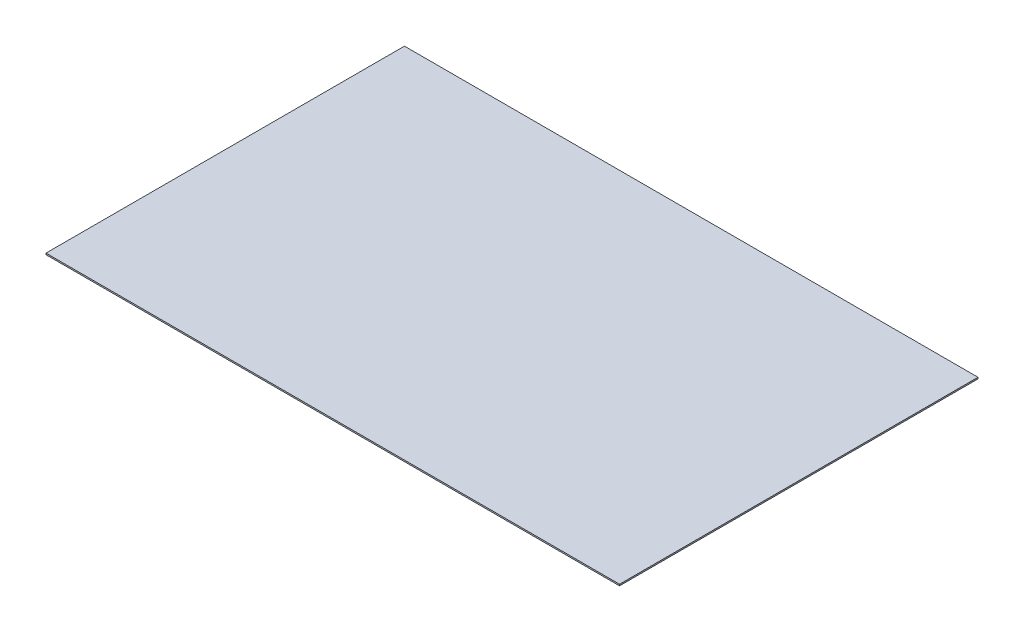
ISO-10303-21;
HEADER;
FILE_DESCRIPTION(('STEP AP214'),'2;1');
FILE_NAME('part.step','',(''),(''),'','','');
FILE_SCHEMA(('AUTOMOTIVE_DESIGN { 1 0 10303 214 1 1 1 1 }'));
ENDSEC;
DATA;
#1=APPLICATION_CONTEXT('core data for automotive mechanical design processes');
#2=APPLICATION_PROTOCOL_DEFINITION('international standard','automotive_design',2000,#1);
#3=PRODUCT_CONTEXT('',#1,'mechanical');
#4=PRODUCT('Part','Part','',(#3));
#5=PRODUCT_RELATED_PRODUCT_CATEGORY('part','',(#4));
#6=PRODUCT_DEFINITION_FORMATION('','',#4);
#7=PRODUCT_DEFINITION_CONTEXT('part definition',#1,'design');
#8=PRODUCT_DEFINITION('design','',#6,#7);
#9=PRODUCT_DEFINITION_SHAPE('','',#8);
#10=(LENGTH_UNIT() NAMED_UNIT(*) SI_UNIT(.MILLI.,.METRE.));
#11=(NAMED_UNIT(*) PLANE_ANGLE_UNIT() SI_UNIT($,.RADIAN.));
#12=(NAMED_UNIT(*) SI_UNIT($,.STERADIAN.) SOLID_ANGLE_UNIT());
#13=UNCERTAINTY_MEASURE_WITH_UNIT(LENGTH_MEASURE(1.E-05),#10,'distance_accuracy_value','');
#14=(GEOMETRIC_REPRESENTATION_CONTEXT(3) GLOBAL_UNCERTAINTY_ASSIGNED_CONTEXT((#13)) GLOBAL_UNIT_ASSIGNED_CONTEXT((#10,
#11,#12)) REPRESENTATION_CONTEXT('',''));
#15=CARTESIAN_POINT('',(0.,0.,0.));
#16=DIRECTION('',(0.,0.,1.));
#17=DIRECTION('',(1.,0.,0.));
#18=AXIS2_PLACEMENT_3D('',#15,#16,#17);
#19=CARTESIAN_POINT('',(2000.,10.,1250.));
#20=DIRECTION('',(-1.,0.,0.));
#21=DIRECTION('',(0.,0.,1.));
#22=AXIS2_PLACEMENT_3D('',#19,#20,#21);
#23=PLANE('',#22);
#24=DIRECTION('',(0.,0.,-1.));
#25=VECTOR('',#24,1.);
#26=CARTESIAN_POINT('',(2000.,0.,1250.));
#27=LINE('',#26,#25);
#28=CARTESIAN_POINT('',(2000.,0.,1250.));
#29=VERTEX_POINT('',#28);
#30=CARTESIAN_POINT('',(2000.,0.,-1250.));
#31=VERTEX_POINT('',#30);
#32=EDGE_CURVE('E99',#29,#31,#27,.T.);
#33=ORIENTED_EDGE('',*,*,#32,.T.);
#34=DIRECTION('',(0.,-1.,0.));
#35=VECTOR('',#34,1.);
#36=CARTESIAN_POINT('',(2000.,10.,-1250.));
#37=LINE('',#36,#35);
#38=CARTESIAN_POINT('',(2000.,10.,-1250.));
#39=VERTEX_POINT('',#38);
#40=EDGE_CURVE('E11',#39,#31,#37,.T.);
#41=ORIENTED_EDGE('',*,*,#40,.F.);
#42=DIRECTION('',(0.,0.,-1.));
#43=VECTOR('',#42,1.);
#44=CARTESIAN_POINT('',(2000.,10.,1250.));
#45=LINE('',#44,#43);
#46=CARTESIAN_POINT('',(2000.,10.,1250.));
#47=VERTEX_POINT('',#46);
#48=EDGE_CURVE('E87',#47,#39,#45,.T.);
#49=ORIENTED_EDGE('',*,*,#48,.F.);
#50=DIRECTION('',(0.,-1.,0.));
#51=VECTOR('',#50,1.);
#52=CARTESIAN_POINT('',(2000.,10.,1250.));
#53=LINE('',#52,#51);
#54=EDGE_CURVE('E95',#47,#29,#53,.T.);
#55=ORIENTED_EDGE('',*,*,#54,.T.);
#56=EDGE_LOOP('',(#33,#41,#49,#55));
#57=FACE_BOUND('',#56,.T.);
#58=ADVANCED_FACE('F36',(#57),#23,.F.);
#59=CARTESIAN_POINT('',(-2000.,10.,-1250.));
#60=DIRECTION('',(0.,0.,1.));
#61=DIRECTION('',(1.,0.,0.));
#62=AXIS2_PLACEMENT_3D('',#59,#60,#61);
#63=PLANE('',#62);
#64=DIRECTION('',(-1.,0.,0.));
#65=VECTOR('',#64,1.);
#66=CARTESIAN_POINT('',(-2000.,0.,-1250.));
#67=LINE('',#66,#65);
#68=CARTESIAN_POINT('',(-2000.,0.,-1250.));
#69=VERTEX_POINT('',#68);
#70=EDGE_CURVE('E91',#31,#69,#67,.T.);
#71=ORIENTED_EDGE('',*,*,#70,.T.);
#72=DIRECTION('',(0.,-1.,0.));
#73=VECTOR('',#72,1.);
#74=CARTESIAN_POINT('',(-2000.,10.,-1250.));
#75=LINE('',#74,#73);
#76=CARTESIAN_POINT('',(-2000.,10.,-1250.));
#77=VERTEX_POINT('',#76);
#78=EDGE_CURVE('E44',#77,#69,#75,.T.);
#79=ORIENTED_EDGE('',*,*,#78,.F.);
#80=DIRECTION('',(-1.,0.,0.));
#81=VECTOR('',#80,1.);
#82=CARTESIAN_POINT('',(-2000.,10.,-1250.));
#83=LINE('',#82,#81);
#84=EDGE_CURVE('E82',#39,#77,#83,.T.);
#85=ORIENTED_EDGE('',*,*,#84,.F.);
#86=ORIENTED_EDGE('',*,*,#40,.T.);
#87=EDGE_LOOP('',(#71,#79,#85,#86));
#88=FACE_BOUND('',#87,.T.);
#89=ADVANCED_FACE('F90',(#88),#63,.F.);
#90=CARTESIAN_POINT('',(-2000.,10.,1250.));
#91=DIRECTION('',(1.,0.,0.));
#92=DIRECTION('',(0.,0.,-1.));
#93=AXIS2_PLACEMENT_3D('',#90,#91,#92);
#94=PLANE('',#93);
#95=DIRECTION('',(0.,0.,1.));
#96=VECTOR('',#95,1.);
#97=CARTESIAN_POINT('',(-2000.,0.,1250.));
#98=LINE('',#97,#96);
#99=CARTESIAN_POINT('',(-2000.,0.,1250.));
#100=VERTEX_POINT('',#99);
#101=EDGE_CURVE('E69',#69,#100,#98,.T.);
#102=ORIENTED_EDGE('',*,*,#101,.T.);
#103=DIRECTION('',(0.,-1.,0.));
#104=VECTOR('',#103,1.);
#105=CARTESIAN_POINT('',(-2000.,10.,1250.));
#106=LINE('',#105,#104);
#107=CARTESIAN_POINT('',(-2000.,10.,1250.));
#108=VERTEX_POINT('',#107);
#109=EDGE_CURVE('E92',#108,#100,#106,.T.);
#110=ORIENTED_EDGE('',*,*,#109,.F.);
#111=DIRECTION('',(0.,0.,1.));
#112=VECTOR('',#111,1.);
#113=CARTESIAN_POINT('',(-2000.,10.,1250.));
#114=LINE('',#113,#112);
#115=EDGE_CURVE('E85',#77,#108,#114,.T.);
#116=ORIENTED_EDGE('',*,*,#115,.F.);
#117=ORIENTED_EDGE('',*,*,#78,.T.);
#118=EDGE_LOOP('',(#102,#110,#116,#117));
#119=FACE_BOUND('',#118,.T.);
#120=ADVANCED_FACE('F93',(#119),#94,.F.);
#121=CARTESIAN_POINT('',(-2000.,10.,1250.));
#122=DIRECTION('',(0.,0.,-1.));
#123=DIRECTION('',(-1.,0.,0.));
#124=AXIS2_PLACEMENT_3D('',#121,#122,#123);
#125=PLANE('',#124);
#126=DIRECTION('',(1.,0.,0.));
#127=VECTOR('',#126,1.);
#128=CARTESIAN_POINT('',(-2000.,0.,1250.));
#129=LINE('',#128,#127);
#130=EDGE_CURVE('E75',#100,#29,#129,.T.);
#131=ORIENTED_EDGE('',*,*,#130,.T.);
#132=ORIENTED_EDGE('',*,*,#54,.F.);
#133=DIRECTION('',(1.,0.,0.));
#134=VECTOR('',#133,1.);
#135=CARTESIAN_POINT('',(-2000.,10.,1250.));
#136=LINE('',#135,#134);
#137=EDGE_CURVE('E52',#108,#47,#136,.T.);
#138=ORIENTED_EDGE('',*,*,#137,.F.);
#139=ORIENTED_EDGE('',*,*,#109,.T.);
#140=EDGE_LOOP('',(#131,#132,#138,#139));
#141=FACE_BOUND('',#140,.T.);
#142=ADVANCED_FACE('F106',(#141),#125,.F.);
#143=CARTESIAN_POINT('',(0.,10.,0.));
#144=DIRECTION('',(0.,-1.,0.));
#145=DIRECTION('',(0.,0.,-1.));
#146=AXIS2_PLACEMENT_3D('',#143,#144,#145);
#147=PLANE('',#146);
#148=ORIENTED_EDGE('',*,*,#48,.T.);
#149=ORIENTED_EDGE('',*,*,#84,.T.);
#150=ORIENTED_EDGE('',*,*,#115,.T.);
#151=ORIENTED_EDGE('',*,*,#137,.T.);
#152=EDGE_LOOP('',(#148,#149,#150,#151));
#153=FACE_BOUND('',#152,.T.);
#154=ADVANCED_FACE('F83',(#153),#147,.F.);
#155=CARTESIAN_POINT('',(0.,0.,0.));
#156=DIRECTION('',(0.,-1.,0.));
#157=DIRECTION('',(0.,0.,-1.));
#158=AXIS2_PLACEMENT_3D('',#155,#156,#157);
#159=PLANE('',#158);
#160=ORIENTED_EDGE('',*,*,#32,.F.);
#161=ORIENTED_EDGE('',*,*,#130,.F.);
#162=ORIENTED_EDGE('',*,*,#101,.F.);
#163=ORIENTED_EDGE('',*,*,#70,.F.);
#164=EDGE_LOOP('',(#160,#161,#162,#163));
#165=FACE_BOUND('',#164,.T.);
#166=ADVANCED_FACE('F109',(#165),#159,.T.);
#167=CLOSED_SHELL('',(#58,#89,#120,#142,#154,#166));
#168=MANIFOLD_SOLID_BREP('B2',#167);
#169=ADVANCED_BREP_SHAPE_REPRESENTATION('',(#18,#168),#14);
#170=SHAPE_DEFINITION_REPRESENTATION(#9,#169);
ENDSEC;
END-ISO-10303-21;
